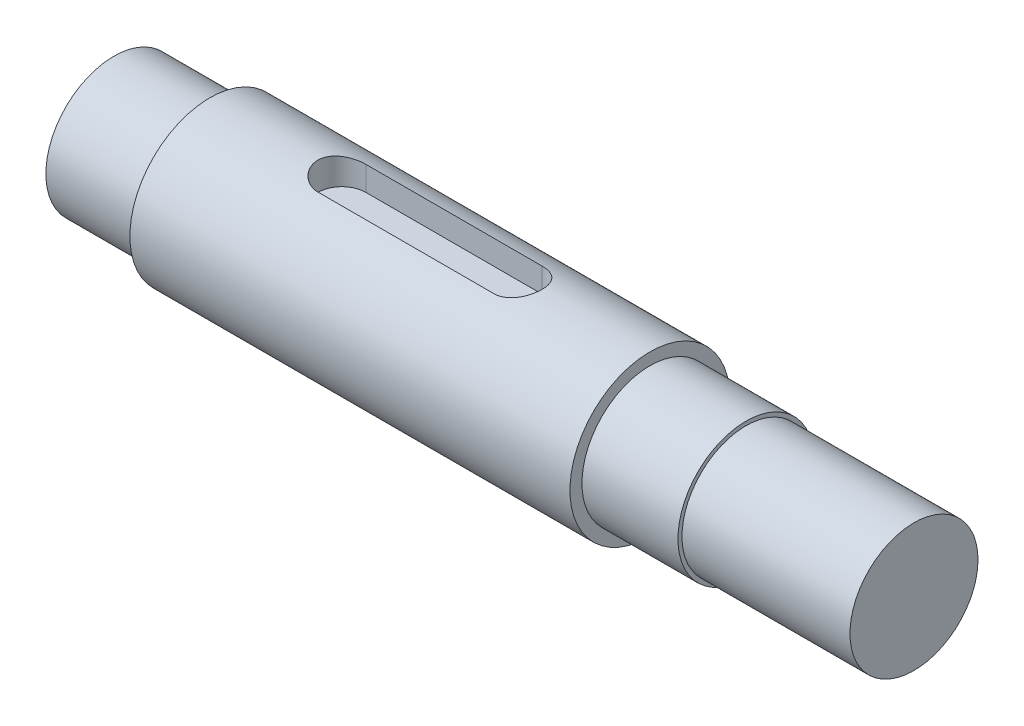
ISO-10303-21;
HEADER;
FILE_DESCRIPTION(('STEP AP214'),'2;1');
FILE_NAME('part.step','',(''),(''),'','','');
FILE_SCHEMA(('AUTOMOTIVE_DESIGN { 1 0 10303 214 1 1 1 1 }'));
ENDSEC;
DATA;
#1=APPLICATION_CONTEXT('core data for automotive mechanical design processes');
#2=APPLICATION_PROTOCOL_DEFINITION('international standard','automotive_design',2000,#1);
#3=PRODUCT_CONTEXT('',#1,'mechanical');
#4=PRODUCT('Part','Part','',(#3));
#5=PRODUCT_RELATED_PRODUCT_CATEGORY('part','',(#4));
#6=PRODUCT_DEFINITION_FORMATION('','',#4);
#7=PRODUCT_DEFINITION_CONTEXT('part definition',#1,'design');
#8=PRODUCT_DEFINITION('design','',#6,#7);
#9=PRODUCT_DEFINITION_SHAPE('','',#8);
#10=(LENGTH_UNIT() NAMED_UNIT(*) SI_UNIT(.MILLI.,.METRE.));
#11=(NAMED_UNIT(*) PLANE_ANGLE_UNIT() SI_UNIT($,.RADIAN.));
#12=(NAMED_UNIT(*) SI_UNIT($,.STERADIAN.) SOLID_ANGLE_UNIT());
#13=UNCERTAINTY_MEASURE_WITH_UNIT(LENGTH_MEASURE(1.E-05),#10,'distance_accuracy_value','');
#14=(GEOMETRIC_REPRESENTATION_CONTEXT(3) GLOBAL_UNCERTAINTY_ASSIGNED_CONTEXT((#13)) GLOBAL_UNIT_ASSIGNED_CONTEXT((#10,
#11,#12)) REPRESENTATION_CONTEXT('',''));
#15=CARTESIAN_POINT('',(0.,0.,0.));
#16=DIRECTION('',(0.,0.,1.));
#17=DIRECTION('',(1.,0.,0.));
#18=AXIS2_PLACEMENT_3D('',#15,#16,#17);
#19=CARTESIAN_POINT('',(100.,0.,0.));
#20=DIRECTION('',(1.,0.,0.));
#21=DIRECTION('',(0.,0.,-1.));
#22=AXIS2_PLACEMENT_3D('',#19,#20,#21);
#23=CYLINDRICAL_SURFACE('',#22,10.);
#24=CARTESIAN_POINT('',(12.,0.,0.));
#25=DIRECTION('',(1.,0.,0.));
#26=DIRECTION('',(0.,0.,-1.));
#27=AXIS2_PLACEMENT_3D('',#24,#25,#26);
#28=CIRCLE('',#27,10.);
#29=CARTESIAN_POINT('',(12.,0.,-10.));
#30=VERTEX_POINT('',#29);
#31=EDGE_CURVE('E119',#30,#30,#28,.T.);
#32=ORIENTED_EDGE('',*,*,#31,.T.);
#33=EDGE_LOOP('',(#32));
#34=FACE_BOUND('',#33,.T.);
#35=CARTESIAN_POINT('',(67.,0.,0.));
#36=DIRECTION('',(1.,0.,0.));
#37=DIRECTION('',(0.,0.,-1.));
#38=AXIS2_PLACEMENT_3D('',#35,#36,#37);
#39=CIRCLE('',#38,10.);
#40=CARTESIAN_POINT('',(67.,0.,-10.));
#41=VERTEX_POINT('',#40);
#42=EDGE_CURVE('E116',#41,#41,#39,.T.);
#43=ORIENTED_EDGE('',*,*,#42,.F.);
#44=EDGE_LOOP('',(#43));
#45=FACE_BOUND('',#44,.T.);
#46=DIRECTION('',(1.,0.,0.));
#47=VECTOR('',#46,1.);
#48=CARTESIAN_POINT('',(100.,9.53939201416946,-3.));
#49=LINE('',#48,#47);
#50=CARTESIAN_POINT('',(28.5,9.53939201416946,-3.));
#51=VERTEX_POINT('',#50);
#52=CARTESIAN_POINT('',(50.5,9.53939201416946,-3.));
#53=VERTEX_POINT('',#52);
#54=EDGE_CURVE('E11',#51,#53,#49,.T.);
#55=ORIENTED_EDGE('',*,*,#54,.T.);
#56=CARTESIAN_POINT('',(50.5,9.53939201416946,-3.));
#57=CARTESIAN_POINT('',(50.5823355208227,9.53938054248207,-3.00001027845728));
#58=CARTESIAN_POINT('',(50.6646644550632,9.54045772064378,-2.99661062684472));
#59=CARTESIAN_POINT('',(50.8286939527654,9.54470412105986,-2.98307142899347));
#60=CARTESIAN_POINT('',(50.9103946533243,9.54787287296848,-2.97293339805418));
#61=CARTESIAN_POINT('',(51.0723849156732,9.55620668351003,-2.94603140625045));
#62=CARTESIAN_POINT('',(51.152677524043,9.56136667250114,-2.92928426957737));
#63=CARTESIAN_POINT('',(51.3114758441342,9.57351626651178,-2.88932853030395));
#64=CARTESIAN_POINT('',(51.3899815090674,9.58050591937828,-2.8661197587264));
#65=CARTESIAN_POINT('',(51.6219493879901,9.60391637654137,-2.78708584446024));
#66=CARTESIAN_POINT('',(51.772068438833,9.62279007830391,-2.72181852542972));
#67=CARTESIAN_POINT('',(52.059226043979,9.66493213967819,-2.56815043531276));
#68=CARTESIAN_POINT('',(52.1962584707622,9.68820254290641,-2.47973889924159));
#69=CARTESIAN_POINT('',(52.4577229879478,9.73733650515374,-2.27929879634442));
#70=CARTESIAN_POINT('',(52.5816848740609,9.76325505469874,-2.16666914746584));
#71=CARTESIAN_POINT('',(52.8092736148387,9.81429628475077,-1.92227736150433));
#72=CARTESIAN_POINT('',(52.912897033861,9.8394188301941,-1.79051199848164));
#73=CARTESIAN_POINT('',(53.0989268650945,9.88666477976534,-1.50821997465697));
#74=CARTESIAN_POINT('',(53.1808501797826,9.90871541546877,-1.35736167401016));
#75=CARTESIAN_POINT('',(53.3179770040029,9.94668940088144,-1.04324233568303));
#76=CARTESIAN_POINT('',(53.3731874033679,9.96261433032403,-0.879984508687984));
#77=CARTESIAN_POINT('',(53.453759551791,9.98615279768398,-0.550649404820599));
#78=CARTESIAN_POINT('',(53.4799297035176,9.99399098526792,-0.384786253016201));
#79=CARTESIAN_POINT('',(53.504234695146,10.0012640407204,-0.0508471415689264));
#80=CARTESIAN_POINT('',(53.5023748426782,10.0007004995012,0.11722839312534));
#81=CARTESIAN_POINT('',(53.4712141793086,9.99139205125586,0.445143199271826));
#82=CARTESIAN_POINT('',(53.4427893091919,9.98290831016512,0.605074290763031));
#83=CARTESIAN_POINT('',(53.3607367303745,9.95903027401822,0.917780104370317));
#84=CARTESIAN_POINT('',(53.3071077013173,9.94363561692558,1.07055445110879));
#85=CARTESIAN_POINT('',(53.1755755564752,9.90730429851782,1.36669563173912));
#86=CARTESIAN_POINT('',(53.0973967112239,9.88630511384915,1.50993201207613));
#87=CARTESIAN_POINT('',(52.9192028199656,9.84099249303646,1.781531059161));
#88=CARTESIAN_POINT('',(52.8191828810593,9.81667831471806,1.90989038323251));
#89=CARTESIAN_POINT('',(52.5956160238154,9.7662334714278,2.15330901082206));
#90=CARTESIAN_POINT('',(52.4713122724738,9.74006890899097,2.26766702955976));
#91=CARTESIAN_POINT('',(52.2050051531489,9.68968430229327,2.47413538985067));
#92=CARTESIAN_POINT('',(52.0629966392702,9.66546482675134,2.5662392402618));
#93=CARTESIAN_POINT('',(51.7634381431001,9.62154457591303,2.72632814481702));
#94=CARTESIAN_POINT('',(51.6057456408128,9.60189192491895,2.79406012682263));
#95=CARTESIAN_POINT('',(51.2805509920368,9.56991327306402,2.90171772009405));
#96=CARTESIAN_POINT('',(51.1130642785713,9.55757606951749,2.94168586436072));
#97=CARTESIAN_POINT('',(50.8700102218596,9.54628064650012,2.97802407180159));
#98=CARTESIAN_POINT('',(50.7962185316408,9.54370312550533,2.98626405978017));
#99=CARTESIAN_POINT('',(50.6482970418009,9.54025857223564,2.99724711229708));
#100=CARTESIAN_POINT('',(50.5741679006723,9.53938902493288,2.99999825936538));
#101=CARTESIAN_POINT('',(50.5,9.53939201416946,3.));
#102=B_SPLINE_CURVE_WITH_KNOTS('',3,(#56,#57,#58,#59,#60,#61,#62,#63,#64,#65,#66,#67,#68,#69,
#70,#71,#72,#73,#74,#75,#76,#77,#78,#79,#80,#81,#82,#83,#84,#85,#86,#87,#88,#89,#90,#91,#92,#93,
#94,#95,#96,#97,#98,#99,#100,#101),.UNSPECIFIED.,.F.,.F.,(4,2,2,2,2,2,2,2,2,2,2,2,2,2,2,2,2,2,2,
2,2,2,4),(0.,0.246918142439467,0.493780777706087,0.740019009623012,0.986263681482027,
1.47813347402026,1.97023245590779,2.47635119822766,2.98255536239032,3.4992281062007,
4.01576751791672,4.51753600864764,5.01920948804101,5.50490358251093,5.99062312360831,
6.48200583350621,6.9734987373917,7.48389234847122,7.99443465298715,8.51013494368215,
9.02504345105574,9.24774267716778,9.47011372732391),.UNSPECIFIED.);
#103=CARTESIAN_POINT('',(50.5,9.53939201416946,3.));
#104=VERTEX_POINT('',#103);
#105=EDGE_CURVE('E49',#53,#104,#102,.T.);
#106=ORIENTED_EDGE('',*,*,#105,.T.);
#107=DIRECTION('',(1.,0.,0.));
#108=VECTOR('',#107,1.);
#109=CARTESIAN_POINT('',(100.,9.53939201416946,3.));
#110=LINE('',#109,#108);
#111=CARTESIAN_POINT('',(28.5,9.53939201416946,3.));
#112=VERTEX_POINT('',#111);
#113=EDGE_CURVE('E135',#104,#112,#110,.F.);
#114=ORIENTED_EDGE('',*,*,#113,.T.);
#115=CARTESIAN_POINT('',(28.5,9.53939201416946,3.));
#116=CARTESIAN_POINT('',(28.4176644791773,9.53938054248207,3.00001027845728));
#117=CARTESIAN_POINT('',(28.3353355449368,9.54045772064378,2.99661062684472));
#118=CARTESIAN_POINT('',(28.1713060472345,9.54470412105986,2.98307142899347));
#119=CARTESIAN_POINT('',(28.0896053466756,9.54787287296848,2.97293339805418));
#120=CARTESIAN_POINT('',(27.9276150843268,9.55620668351003,2.94603140625045));
#121=CARTESIAN_POINT('',(27.847322475957,9.56136667250114,2.92928426957737));
#122=CARTESIAN_POINT('',(27.6885241558658,9.57351626651178,2.88932853030395));
#123=CARTESIAN_POINT('',(27.6100184909326,9.58050591937828,2.86611975872641));
#124=CARTESIAN_POINT('',(27.3780506120099,9.60391637654137,2.78708584446024));
#125=CARTESIAN_POINT('',(27.227931561167,9.62279007830391,2.72181852542972));
#126=CARTESIAN_POINT('',(26.940773956021,9.66493213967819,2.56815043531276));
#127=CARTESIAN_POINT('',(26.8037415292378,9.6882025429064,2.4797388992416));
#128=CARTESIAN_POINT('',(26.5422770120522,9.73733650515374,2.27929879634443));
#129=CARTESIAN_POINT('',(26.4183151259391,9.76325505469874,2.16666914746584));
#130=CARTESIAN_POINT('',(26.1907263851612,9.81429628475077,1.92227736150433));
#131=CARTESIAN_POINT('',(26.087102966139,9.8394188301941,1.79051199848164));
#132=CARTESIAN_POINT('',(25.9010731349054,9.88666477976534,1.50821997465697));
#133=CARTESIAN_POINT('',(25.8191498202174,9.90871541546877,1.35736167401016));
#134=CARTESIAN_POINT('',(25.6820229959971,9.94668940088144,1.04324233568303));
#135=CARTESIAN_POINT('',(25.626812596632,9.96261433032403,0.879984508687986));
#136=CARTESIAN_POINT('',(25.546240448209,9.98615279768398,0.550649404820603));
#137=CARTESIAN_POINT('',(25.5200702964824,9.99399098526792,0.384786253016204));
#138=CARTESIAN_POINT('',(25.495765304854,10.0012640407204,0.0508471415689291));
#139=CARTESIAN_POINT('',(25.4976251573218,10.0007004995012,-0.117228393125338));
#140=CARTESIAN_POINT('',(25.5287858206914,9.99139205125586,-0.445143199271823));
#141=CARTESIAN_POINT('',(25.5572106908081,9.98290831016512,-0.605074290763026));
#142=CARTESIAN_POINT('',(25.6392632696255,9.95903027401822,-0.917780104370312));
#143=CARTESIAN_POINT('',(25.6928922986827,9.94363561692558,-1.07055445110879));
#144=CARTESIAN_POINT('',(25.8244244435247,9.90730429851782,-1.36669563173911));
#145=CARTESIAN_POINT('',(25.9026032887761,9.88630511384915,-1.50993201207612));
#146=CARTESIAN_POINT('',(26.0807971800344,9.84099249303647,-1.781531059161));
#147=CARTESIAN_POINT('',(26.1808171189407,9.81667831471806,-1.9098903832325));
#148=CARTESIAN_POINT('',(26.4043839761846,9.7662334714278,-2.15330901082205));
#149=CARTESIAN_POINT('',(26.5286877275262,9.74006890899097,-2.26766702955975));
#150=CARTESIAN_POINT('',(26.7949948468511,9.68968430229327,-2.47413538985067));
#151=CARTESIAN_POINT('',(26.9370033607298,9.66546482675134,-2.5662392402618));
#152=CARTESIAN_POINT('',(27.2365618568999,9.62154457591303,-2.72632814481701));
#153=CARTESIAN_POINT('',(27.3942543591871,9.60189192491895,-2.79406012682262));
#154=CARTESIAN_POINT('',(27.7194490079631,9.56991327306402,-2.90171772009404));
#155=CARTESIAN_POINT('',(27.8869357214287,9.55757606951749,-2.94168586436072));
#156=CARTESIAN_POINT('',(28.1299897781404,9.54628064650012,-2.97802407180159));
#157=CARTESIAN_POINT('',(28.2037814683592,9.54370312550533,-2.98626405978017));
#158=CARTESIAN_POINT('',(28.351702958199,9.54025857223564,-2.99724711229708));
#159=CARTESIAN_POINT('',(28.4258320993277,9.53938902493288,-2.99999825936538));
#160=CARTESIAN_POINT('',(28.5,9.53939201416946,-3.));
#161=B_SPLINE_CURVE_WITH_KNOTS('',3,(#115,#116,#117,#118,#119,#120,#121,#122,#123,#124,#125,
#126,#127,#128,#129,#130,#131,#132,#133,#134,#135,#136,#137,#138,#139,#140,#141,#142,#143,#144,
#145,#146,#147,#148,#149,#150,#151,#152,#153,#154,#155,#156,#157,#158,#159,#160),.UNSPECIFIED.,
.F.,.F.,(4,2,2,2,2,2,2,2,2,2,2,2,2,2,2,2,2,2,2,2,2,2,4),(0.,0.246918142439467,0.493780777706087,
0.740019009623009,0.986263681482023,1.47813347402025,1.97023245590779,2.47635119822766,
2.98255536239033,3.4992281062007,4.01576751791672,4.51753600864764,5.019209488041,
5.50490358251092,5.99062312360831,6.48200583350621,6.97349873739169,7.48389234847122,
7.99443465298714,8.51013494368214,9.02504345105574,9.24774267716777,9.47011372732391),.UNSPECIFIED.);
#162=EDGE_CURVE('E42',#112,#51,#161,.T.);
#163=ORIENTED_EDGE('',*,*,#162,.T.);
#164=EDGE_LOOP('',(#55,#106,#114,#163));
#165=FACE_BOUND('',#164,.T.);
#166=ADVANCED_FACE('F34',(#34,#45,#165),#23,.T.);
#167=CARTESIAN_POINT('',(0.,0.,0.));
#168=DIRECTION('',(-1.,0.,0.));
#169=DIRECTION('',(0.,0.,1.));
#170=AXIS2_PLACEMENT_3D('',#167,#168,#169);
#171=PLANE('',#170);
#172=CARTESIAN_POINT('',(0.,0.,0.));
#173=DIRECTION('',(1.,0.,0.));
#174=DIRECTION('',(0.,0.,-1.));
#175=AXIS2_PLACEMENT_3D('',#172,#173,#174);
#176=CIRCLE('',#175,8.5);
#177=CARTESIAN_POINT('',(0.,0.,-8.5));
#178=VERTEX_POINT('',#177);
#179=EDGE_CURVE('E125',#178,#178,#176,.T.);
#180=ORIENTED_EDGE('',*,*,#179,.F.);
#181=EDGE_LOOP('',(#180));
#182=FACE_BOUND('',#181,.T.);
#183=ADVANCED_FACE('F36',(#182),#171,.T.);
#184=CARTESIAN_POINT('',(100.,0.,0.));
#185=DIRECTION('',(1.,0.,0.));
#186=DIRECTION('',(0.,0.,-1.));
#187=AXIS2_PLACEMENT_3D('',#184,#185,#186);
#188=CYLINDRICAL_SURFACE('',#187,8.5);
#189=ORIENTED_EDGE('',*,*,#179,.T.);
#190=EDGE_LOOP('',(#189));
#191=FACE_BOUND('',#190,.T.);
#192=CARTESIAN_POINT('',(12.,0.,0.));
#193=DIRECTION('',(1.,0.,0.));
#194=DIRECTION('',(0.,0.,-1.));
#195=AXIS2_PLACEMENT_3D('',#192,#193,#194);
#196=CIRCLE('',#195,8.5);
#197=CARTESIAN_POINT('',(12.,0.,-8.5));
#198=VERTEX_POINT('',#197);
#199=EDGE_CURVE('E122',#198,#198,#196,.T.);
#200=ORIENTED_EDGE('',*,*,#199,.F.);
#201=EDGE_LOOP('',(#200));
#202=FACE_BOUND('',#201,.T.);
#203=ADVANCED_FACE('F168',(#191,#202),#188,.T.);
#204=CARTESIAN_POINT('',(12.,8.5,0.));
#205=DIRECTION('',(-1.,0.,0.));
#206=DIRECTION('',(0.,0.,1.));
#207=AXIS2_PLACEMENT_3D('',#204,#205,#206);
#208=PLANE('',#207);
#209=ORIENTED_EDGE('',*,*,#199,.T.);
#210=EDGE_LOOP('',(#209));
#211=FACE_BOUND('',#210,.T.);
#212=ORIENTED_EDGE('',*,*,#31,.F.);
#213=EDGE_LOOP('',(#212));
#214=FACE_BOUND('',#213,.T.);
#215=ADVANCED_FACE('F178',(#211,#214),#208,.T.);
#216=CARTESIAN_POINT('',(67.,10.,0.));
#217=DIRECTION('',(1.,0.,0.));
#218=DIRECTION('',(0.,0.,-1.));
#219=AXIS2_PLACEMENT_3D('',#216,#217,#218);
#220=PLANE('',#219);
#221=ORIENTED_EDGE('',*,*,#42,.T.);
#222=EDGE_LOOP('',(#221));
#223=FACE_BOUND('',#222,.T.);
#224=CARTESIAN_POINT('',(67.,0.,0.));
#225=DIRECTION('',(1.,0.,0.));
#226=DIRECTION('',(0.,0.,-1.));
#227=AXIS2_PLACEMENT_3D('',#224,#225,#226);
#228=CIRCLE('',#227,8.5);
#229=CARTESIAN_POINT('',(67.,0.,-8.5));
#230=VERTEX_POINT('',#229);
#231=EDGE_CURVE('E113',#230,#230,#228,.T.);
#232=ORIENTED_EDGE('',*,*,#231,.F.);
#233=EDGE_LOOP('',(#232));
#234=FACE_BOUND('',#233,.T.);
#235=ADVANCED_FACE('F174',(#223,#234),#220,.T.);
#236=CARTESIAN_POINT('',(100.,0.,0.));
#237=DIRECTION('',(1.,0.,0.));
#238=DIRECTION('',(0.,0.,-1.));
#239=AXIS2_PLACEMENT_3D('',#236,#237,#238);
#240=CYLINDRICAL_SURFACE('',#239,8.5);
#241=ORIENTED_EDGE('',*,*,#231,.T.);
#242=EDGE_LOOP('',(#241));
#243=FACE_BOUND('',#242,.T.);
#244=CARTESIAN_POINT('',(79.,0.,0.));
#245=DIRECTION('',(1.,0.,0.));
#246=DIRECTION('',(0.,0.,-1.));
#247=AXIS2_PLACEMENT_3D('',#244,#245,#246);
#248=CIRCLE('',#247,8.5);
#249=CARTESIAN_POINT('',(79.,0.,-8.5));
#250=VERTEX_POINT('',#249);
#251=EDGE_CURVE('E110',#250,#250,#248,.T.);
#252=ORIENTED_EDGE('',*,*,#251,.F.);
#253=EDGE_LOOP('',(#252));
#254=FACE_BOUND('',#253,.T.);
#255=ADVANCED_FACE('F177',(#243,#254),#240,.T.);
#256=CARTESIAN_POINT('',(79.,8.5,0.));
#257=DIRECTION('',(1.,0.,0.));
#258=DIRECTION('',(0.,0.,-1.));
#259=AXIS2_PLACEMENT_3D('',#256,#257,#258);
#260=PLANE('',#259);
#261=ORIENTED_EDGE('',*,*,#251,.T.);
#262=EDGE_LOOP('',(#261));
#263=FACE_BOUND('',#262,.T.);
#264=CARTESIAN_POINT('',(79.,0.,0.));
#265=DIRECTION('',(1.,0.,0.));
#266=DIRECTION('',(0.,0.,-1.));
#267=AXIS2_PLACEMENT_3D('',#264,#265,#266);
#268=CIRCLE('',#267,8.);
#269=CARTESIAN_POINT('',(79.,0.,-8.));
#270=VERTEX_POINT('',#269);
#271=EDGE_CURVE('E107',#270,#270,#268,.T.);
#272=ORIENTED_EDGE('',*,*,#271,.F.);
#273=EDGE_LOOP('',(#272));
#274=FACE_BOUND('',#273,.T.);
#275=ADVANCED_FACE('F183',(#263,#274),#260,.T.);
#276=CARTESIAN_POINT('',(100.,0.,0.));
#277=DIRECTION('',(1.,0.,0.));
#278=DIRECTION('',(0.,0.,-1.));
#279=AXIS2_PLACEMENT_3D('',#276,#277,#278);
#280=CYLINDRICAL_SURFACE('',#279,8.);
#281=ORIENTED_EDGE('',*,*,#271,.T.);
#282=EDGE_LOOP('',(#281));
#283=FACE_BOUND('',#282,.T.);
#284=CARTESIAN_POINT('',(100.,0.,0.));
#285=DIRECTION('',(1.,0.,0.));
#286=DIRECTION('',(0.,0.,-1.));
#287=AXIS2_PLACEMENT_3D('',#284,#285,#286);
#288=CIRCLE('',#287,8.);
#289=CARTESIAN_POINT('',(100.,0.,-8.));
#290=VERTEX_POINT('',#289);
#291=EDGE_CURVE('E81',#290,#290,#288,.T.);
#292=ORIENTED_EDGE('',*,*,#291,.F.);
#293=EDGE_LOOP('',(#292));
#294=FACE_BOUND('',#293,.T.);
#295=ADVANCED_FACE('F189',(#283,#294),#280,.T.);
#296=CARTESIAN_POINT('',(100.,8.,0.));
#297=DIRECTION('',(1.,0.,0.));
#298=DIRECTION('',(0.,0.,-1.));
#299=AXIS2_PLACEMENT_3D('',#296,#297,#298);
#300=PLANE('',#299);
#301=ORIENTED_EDGE('',*,*,#291,.T.);
#302=EDGE_LOOP('',(#301));
#303=FACE_BOUND('',#302,.T.);
#304=ADVANCED_FACE('F151',(#303),#300,.T.);
#305=CARTESIAN_POINT('',(28.5,10.,0.));
#306=DIRECTION('',(0.,-1.,0.));
#307=DIRECTION('',(0.,0.,-1.));
#308=AXIS2_PLACEMENT_3D('',#305,#306,#307);
#309=CYLINDRICAL_SURFACE('',#308,3.);
#310=DIRECTION('',(0.,-1.,0.));
#311=VECTOR('',#310,1.);
#312=CARTESIAN_POINT('',(28.5,10.,3.));
#313=LINE('',#312,#311);
#314=CARTESIAN_POINT('',(28.5,6.5,3.));
#315=VERTEX_POINT('',#314);
#316=EDGE_CURVE('E74',#112,#315,#313,.T.);
#317=ORIENTED_EDGE('',*,*,#316,.T.);
#318=CARTESIAN_POINT('',(28.5,6.5,0.));
#319=DIRECTION('',(0.,1.,0.));
#320=DIRECTION('',(0.,0.,1.));
#321=AXIS2_PLACEMENT_3D('',#318,#319,#320);
#322=CIRCLE('',#321,3.);
#323=CARTESIAN_POINT('',(28.5,6.5,-3.));
#324=VERTEX_POINT('',#323);
#325=EDGE_CURVE('E78',#324,#315,#322,.T.);
#326=ORIENTED_EDGE('',*,*,#325,.F.);
#327=DIRECTION('',(0.,-1.,0.));
#328=VECTOR('',#327,1.);
#329=CARTESIAN_POINT('',(28.5,10.,-3.));
#330=LINE('',#329,#328);
#331=EDGE_CURVE('E100',#51,#324,#330,.T.);
#332=ORIENTED_EDGE('',*,*,#331,.F.);
#333=ORIENTED_EDGE('',*,*,#162,.F.);
#334=EDGE_LOOP('',(#317,#326,#332,#333));
#335=FACE_BOUND('',#334,.T.);
#336=ADVANCED_FACE('F76',(#335),#309,.F.);
#337=CARTESIAN_POINT('',(28.5,10.,3.));
#338=DIRECTION('',(0.,0.,-1.));
#339=DIRECTION('',(-1.,0.,0.));
#340=AXIS2_PLACEMENT_3D('',#337,#338,#339);
#341=PLANE('',#340);
#342=DIRECTION('',(0.,-1.,0.));
#343=VECTOR('',#342,1.);
#344=CARTESIAN_POINT('',(50.5,10.,3.));
#345=LINE('',#344,#343);
#346=CARTESIAN_POINT('',(50.5,6.5,3.));
#347=VERTEX_POINT('',#346);
#348=EDGE_CURVE('E82',#104,#347,#345,.T.);
#349=ORIENTED_EDGE('',*,*,#348,.T.);
#350=DIRECTION('',(1.,0.,0.));
#351=VECTOR('',#350,1.);
#352=CARTESIAN_POINT('',(28.5,6.5,3.));
#353=LINE('',#352,#351);
#354=EDGE_CURVE('E85',#315,#347,#353,.T.);
#355=ORIENTED_EDGE('',*,*,#354,.F.);
#356=ORIENTED_EDGE('',*,*,#316,.F.);
#357=ORIENTED_EDGE('',*,*,#113,.F.);
#358=EDGE_LOOP('',(#349,#355,#356,#357));
#359=FACE_BOUND('',#358,.T.);
#360=ADVANCED_FACE('F86',(#359),#341,.T.);
#361=CARTESIAN_POINT('',(50.5,10.,0.));
#362=DIRECTION('',(0.,-1.,0.));
#363=DIRECTION('',(0.,0.,-1.));
#364=AXIS2_PLACEMENT_3D('',#361,#362,#363);
#365=CYLINDRICAL_SURFACE('',#364,3.);
#366=DIRECTION('',(0.,-1.,0.));
#367=VECTOR('',#366,1.);
#368=CARTESIAN_POINT('',(50.5,10.,-3.));
#369=LINE('',#368,#367);
#370=CARTESIAN_POINT('',(50.5,6.5,-3.));
#371=VERTEX_POINT('',#370);
#372=EDGE_CURVE('E102',#53,#371,#369,.T.);
#373=ORIENTED_EDGE('',*,*,#372,.T.);
#374=CARTESIAN_POINT('',(50.5,6.5,0.));
#375=DIRECTION('',(0.,1.,0.));
#376=DIRECTION('',(0.,0.,1.));
#377=AXIS2_PLACEMENT_3D('',#374,#375,#376);
#378=CIRCLE('',#377,3.);
#379=EDGE_CURVE('E90',#347,#371,#378,.T.);
#380=ORIENTED_EDGE('',*,*,#379,.F.);
#381=ORIENTED_EDGE('',*,*,#348,.F.);
#382=ORIENTED_EDGE('',*,*,#105,.F.);
#383=EDGE_LOOP('',(#373,#380,#381,#382));
#384=FACE_BOUND('',#383,.T.);
#385=ADVANCED_FACE('F139',(#384),#365,.F.);
#386=CARTESIAN_POINT('',(28.5,10.,-3.));
#387=DIRECTION('',(0.,0.,1.));
#388=DIRECTION('',(1.,0.,0.));
#389=AXIS2_PLACEMENT_3D('',#386,#387,#388);
#390=PLANE('',#389);
#391=ORIENTED_EDGE('',*,*,#331,.T.);
#392=DIRECTION('',(-1.,0.,0.));
#393=VECTOR('',#392,1.);
#394=CARTESIAN_POINT('',(28.5,6.5,-3.));
#395=LINE('',#394,#393);
#396=EDGE_CURVE('E95',#371,#324,#395,.T.);
#397=ORIENTED_EDGE('',*,*,#396,.F.);
#398=ORIENTED_EDGE('',*,*,#372,.F.);
#399=ORIENTED_EDGE('',*,*,#54,.F.);
#400=EDGE_LOOP('',(#391,#397,#398,#399));
#401=FACE_BOUND('',#400,.T.);
#402=ADVANCED_FACE('F144',(#401),#390,.T.);
#403=CARTESIAN_POINT('',(28.5,6.5,0.));
#404=DIRECTION('',(0.,1.,0.));
#405=DIRECTION('',(0.,0.,1.));
#406=AXIS2_PLACEMENT_3D('',#403,#404,#405);
#407=PLANE('',#406);
#408=ORIENTED_EDGE('',*,*,#325,.T.);
#409=ORIENTED_EDGE('',*,*,#354,.T.);
#410=ORIENTED_EDGE('',*,*,#379,.T.);
#411=ORIENTED_EDGE('',*,*,#396,.T.);
#412=EDGE_LOOP('',(#408,#409,#410,#411));
#413=FACE_BOUND('',#412,.T.);
#414=ADVANCED_FACE('F93',(#413),#407,.T.);
#415=CLOSED_SHELL('',(#166,#183,#203,#215,#235,#255,#275,#295,#304,#336,#360,#385,#402,#414));
#416=MANIFOLD_SOLID_BREP('B2',#415);
#417=ADVANCED_BREP_SHAPE_REPRESENTATION('',(#18,#416),#14);
#418=SHAPE_DEFINITION_REPRESENTATION(#9,#417);
ENDSEC;
END-ISO-10303-21;
